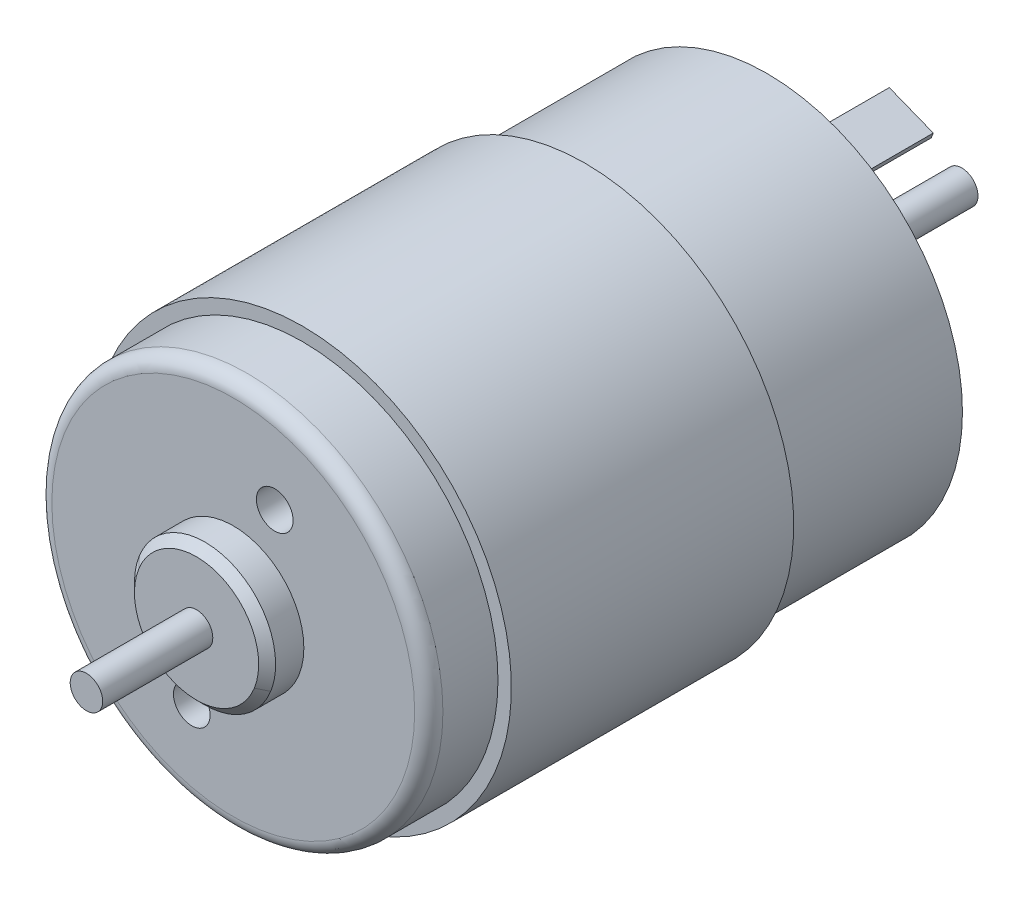
ISO-10303-21;
HEADER;
FILE_DESCRIPTION(('STEP AP214'),'2;1');
FILE_NAME('part.step','',(''),(''),'','','');
FILE_SCHEMA(('AUTOMOTIVE_DESIGN { 1 0 10303 214 1 1 1 1 }'));
ENDSEC;
DATA;
#1=APPLICATION_CONTEXT('core data for automotive mechanical design processes');
#2=APPLICATION_PROTOCOL_DEFINITION('international standard','automotive_design',2000,#1);
#3=PRODUCT_CONTEXT('',#1,'mechanical');
#4=PRODUCT('Part','Part','',(#3));
#5=PRODUCT_RELATED_PRODUCT_CATEGORY('part','',(#4));
#6=PRODUCT_DEFINITION_FORMATION('','',#4);
#7=PRODUCT_DEFINITION_CONTEXT('part definition',#1,'design');
#8=PRODUCT_DEFINITION('design','',#6,#7);
#9=PRODUCT_DEFINITION_SHAPE('','',#8);
#10=(LENGTH_UNIT() NAMED_UNIT(*) SI_UNIT(.MILLI.,.METRE.));
#11=(NAMED_UNIT(*) PLANE_ANGLE_UNIT() SI_UNIT($,.RADIAN.));
#12=(NAMED_UNIT(*) SI_UNIT($,.STERADIAN.) SOLID_ANGLE_UNIT());
#13=UNCERTAINTY_MEASURE_WITH_UNIT(LENGTH_MEASURE(1.E-05),#10,'distance_accuracy_value','');
#14=(GEOMETRIC_REPRESENTATION_CONTEXT(3) GLOBAL_UNCERTAINTY_ASSIGNED_CONTEXT((#13)) GLOBAL_UNIT_ASSIGNED_CONTEXT((#10,
#11,#12)) REPRESENTATION_CONTEXT('',''));
#15=CARTESIAN_POINT('',(0.,0.,0.));
#16=DIRECTION('',(0.,0.,1.));
#17=DIRECTION('',(1.,0.,0.));
#18=AXIS2_PLACEMENT_3D('',#15,#16,#17);
#19=CARTESIAN_POINT('',(0.,0.,48.2));
#20=DIRECTION('',(0.,0.,1.));
#21=DIRECTION('',(1.,0.,0.));
#22=AXIS2_PLACEMENT_3D('',#19,#20,#21);
#23=PLANE('',#22);
#24=CARTESIAN_POINT('',(0.,0.,48.2));
#25=DIRECTION('',(0.,0.,1.));
#26=DIRECTION('',(1.,0.,0.));
#27=AXIS2_PLACEMENT_3D('',#24,#25,#26);
#28=CIRCLE('',#27,1.15);
#29=CARTESIAN_POINT('',(1.15,0.,48.2));
#30=VERTEX_POINT('',#29);
#31=EDGE_CURVE('E195',#30,#30,#28,.F.);
#32=ORIENTED_EDGE('',*,*,#31,.F.);
#33=EDGE_LOOP('',(#32));
#34=FACE_BOUND('',#33,.T.);
#35=ADVANCED_FACE('F16',(#34),#23,.T.);
#36=CARTESIAN_POINT('',(0.,0.,-13.8));
#37=DIRECTION('',(0.,0.,1.));
#38=DIRECTION('',(1.,0.,0.));
#39=AXIS2_PLACEMENT_3D('',#36,#37,#38);
#40=CYLINDRICAL_SURFACE('',#39,1.15);
#41=ORIENTED_EDGE('',*,*,#31,.T.);
#42=EDGE_LOOP('',(#41));
#43=FACE_BOUND('',#42,.T.);
#44=CARTESIAN_POINT('',(0.,0.,40.4));
#45=DIRECTION('',(0.,0.,1.));
#46=DIRECTION('',(1.,0.,0.));
#47=AXIS2_PLACEMENT_3D('',#44,#45,#46);
#48=CIRCLE('',#47,1.15);
#49=CARTESIAN_POINT('',(1.15,0.,40.4));
#50=VERTEX_POINT('',#49);
#51=EDGE_CURVE('E191',#50,#50,#48,.F.);
#52=ORIENTED_EDGE('',*,*,#51,.F.);
#53=EDGE_LOOP('',(#52));
#54=FACE_BOUND('',#53,.T.);
#55=ADVANCED_FACE('F297',(#43,#54),#40,.T.);
#56=CARTESIAN_POINT('',(0.,0.,-13.8));
#57=DIRECTION('',(0.,0.,1.));
#58=DIRECTION('',(1.,0.,0.));
#59=AXIS2_PLACEMENT_3D('',#56,#57,#58);
#60=PLANE('',#59);
#61=CARTESIAN_POINT('',(0.,0.,-13.8));
#62=DIRECTION('',(0.,0.,1.));
#63=DIRECTION('',(1.,0.,0.));
#64=AXIS2_PLACEMENT_3D('',#61,#62,#63);
#65=CIRCLE('',#64,1.15);
#66=CARTESIAN_POINT('',(1.15,0.,-13.8));
#67=VERTEX_POINT('',#66);
#68=EDGE_CURVE('E110',#67,#67,#65,.T.);
#69=ORIENTED_EDGE('',*,*,#68,.F.);
#70=EDGE_LOOP('',(#69));
#71=FACE_BOUND('',#70,.T.);
#72=ADVANCED_FACE('F295',(#71),#60,.F.);
#73=CARTESIAN_POINT('',(0.,0.,40.4));
#74=DIRECTION('',(0.,0.,1.));
#75=DIRECTION('',(1.,0.,0.));
#76=AXIS2_PLACEMENT_3D('',#73,#74,#75);
#77=PLANE('',#76);
#78=CARTESIAN_POINT('',(0.,0.,40.4000000000337));
#79=DIRECTION('',(0.,0.,-1.));
#80=DIRECTION('',(-1.,0.,0.));
#81=AXIS2_PLACEMENT_3D('',#78,#79,#80);
#82=CIRCLE('',#81,4.39999999999257);
#83=CARTESIAN_POINT('',(4.09233299291247,-1.61641909016649,40.4000000000337));
#84=VERTEX_POINT('',#83);
#85=CARTESIAN_POINT('',(-4.09233299291145,1.61641909016907,40.4000000000337));
#86=VERTEX_POINT('',#85);
#87=EDGE_CURVE('E99',#84,#86,#82,.T.);
#88=ORIENTED_EDGE('',*,*,#87,.F.);
#89=CARTESIAN_POINT('',(0.,0.,40.4000000000337));
#90=DIRECTION('',(0.,0.,-1.));
#91=DIRECTION('',(-1.,0.,0.));
#92=AXIS2_PLACEMENT_3D('',#89,#90,#91);
#93=CIRCLE('',#92,4.39999999999257);
#94=EDGE_CURVE('E112',#86,#84,#93,.T.);
#95=ORIENTED_EDGE('',*,*,#94,.F.);
#96=EDGE_LOOP('',(#88,#95));
#97=FACE_BOUND('',#96,.T.);
#98=ORIENTED_EDGE('',*,*,#51,.T.);
#99=EDGE_LOOP('',(#98));
#100=FACE_BOUND('',#99,.T.);
#101=ADVANCED_FACE('F113',(#97,#100),#77,.T.);
#102=CARTESIAN_POINT('',(0.,0.,-13.8));
#103=DIRECTION('',(0.,0.,1.));
#104=DIRECTION('',(1.,0.,0.));
#105=AXIS2_PLACEMENT_3D('',#102,#103,#104);
#106=CYLINDRICAL_SURFACE('',#105,1.15);
#107=ORIENTED_EDGE('',*,*,#68,.T.);
#108=EDGE_LOOP('',(#107));
#109=FACE_BOUND('',#108,.T.);
#110=CARTESIAN_POINT('',(0.,0.,-2.6));
#111=DIRECTION('',(0.,0.,1.));
#112=DIRECTION('',(1.,0.,0.));
#113=AXIS2_PLACEMENT_3D('',#110,#111,#112);
#114=CIRCLE('',#113,1.15);
#115=CARTESIAN_POINT('',(1.15,0.,-2.6));
#116=VERTEX_POINT('',#115);
#117=EDGE_CURVE('E133',#116,#116,#114,.T.);
#118=ORIENTED_EDGE('',*,*,#117,.F.);
#119=EDGE_LOOP('',(#118));
#120=FACE_BOUND('',#119,.T.);
#121=ADVANCED_FACE('F288',(#109,#120),#106,.T.);
#122=CARTESIAN_POINT('',(-2.93894380030565,-7.44060544167246,34.5836800131004));
#123=DIRECTION('',(0.,0.,-1.));
#124=DIRECTION('',(0.,1.,0.));
#125=AXIS2_PLACEMENT_3D('',#122,#123,#124);
#126=PLANE('',#125);
#127=CARTESIAN_POINT('',(-2.93894380030565,-7.44060544167246,34.5836800131004));
#128=DIRECTION('',(0.,0.,-1.));
#129=DIRECTION('',(0.,1.,0.));
#130=AXIS2_PLACEMENT_3D('',#127,#128,#129);
#131=CIRCLE('',#130,1.3);
#132=CARTESIAN_POINT('',(-2.93894380030565,-6.14060544167246,34.5836800131004));
#133=VERTEX_POINT('',#132);
#134=EDGE_CURVE('E181',#133,#133,#131,.F.);
#135=ORIENTED_EDGE('',*,*,#134,.T.);
#136=EDGE_LOOP('',(#135));
#137=FACE_BOUND('',#136,.T.);
#138=ADVANCED_FACE('F284',(#137),#126,.F.);
#139=CARTESIAN_POINT('',(2.93894380030561,7.44060544167237,34.5836800131004));
#140=DIRECTION('',(0.,0.,-1.));
#141=DIRECTION('',(0.,1.,0.));
#142=AXIS2_PLACEMENT_3D('',#139,#140,#141);
#143=PLANE('',#142);
#144=CARTESIAN_POINT('',(2.9389438003056,7.44060544167237,34.5836800131004));
#145=DIRECTION('',(0.,0.,-1.));
#146=DIRECTION('',(0.,1.,0.));
#147=AXIS2_PLACEMENT_3D('',#144,#145,#146);
#148=CIRCLE('',#147,1.3);
#149=CARTESIAN_POINT('',(2.9389438003056,8.74060544167237,34.5836800131004));
#150=VERTEX_POINT('',#149);
#151=EDGE_CURVE('E176',#150,#150,#148,.F.);
#152=ORIENTED_EDGE('',*,*,#151,.T.);
#153=EDGE_LOOP('',(#152));
#154=FACE_BOUND('',#153,.T.);
#155=ADVANCED_FACE('F281',(#154),#143,.F.);
#156=CARTESIAN_POINT('',(0.,0.,39.8000000000138));
#157=DIRECTION('',(0.,0.,-1.));
#158=DIRECTION('',(-1.,0.,0.));
#159=AXIS2_PLACEMENT_3D('',#156,#157,#158);
#160=CONICAL_SURFACE('',#159,5.00000000000061,0.785398163387545);
#161=DIRECTION('',(-0.657662820492747,0.259768386339687,0.707106781186548));
#162=VECTOR('',#161,1.);
#163=CARTESIAN_POINT('',(464149.431814956,-183333.077628924,-499000.));
#164=LINE('',#163,#162);
#165=CARTESIAN_POINT('',(4.65037840102838,-1.83683987519109,39.8000000000177));
#166=VERTEX_POINT('',#165);
#167=EDGE_CURVE('E107',#84,#166,#164,.F.);
#168=ORIENTED_EDGE('',*,*,#167,.F.);
#169=ORIENTED_EDGE('',*,*,#87,.T.);
#170=DIRECTION('',(0.657662820492511,-0.259768386340284,0.707106781186548));
#171=VECTOR('',#170,1.);
#172=CARTESIAN_POINT('',(-464149.43181479,183333.077629345,-499000.));
#173=LINE('',#172,#171);
#174=CARTESIAN_POINT('',(-4.65037840102931,1.83683987518161,39.8000000000177));
#175=VERTEX_POINT('',#174);
#176=EDGE_CURVE('E104',#175,#86,#173,.T.);
#177=ORIENTED_EDGE('',*,*,#176,.F.);
#178=CARTESIAN_POINT('',(0.,0.,39.8));
#179=DIRECTION('',(0.,0.,1.));
#180=DIRECTION('',(1.,0.,0.));
#181=AXIS2_PLACEMENT_3D('',#178,#179,#180);
#182=CIRCLE('',#181,5.);
#183=EDGE_CURVE('E180',#166,#175,#182,.F.);
#184=ORIENTED_EDGE('',*,*,#183,.F.);
#185=EDGE_LOOP('',(#168,#169,#177,#184));
#186=FACE_BOUND('',#185,.T.);
#187=ADVANCED_FACE('F102',(#186),#160,.T.);
#188=CARTESIAN_POINT('',(0.,0.,39.8000000000707));
#189=DIRECTION('',(0.,0.,-1.));
#190=DIRECTION('',(-1.,0.,0.));
#191=AXIS2_PLACEMENT_3D('',#188,#189,#190);
#192=CONICAL_SURFACE('',#191,4.99999999992685,0.785398163373455);
#193=ORIENTED_EDGE('',*,*,#167,.T.);
#194=CARTESIAN_POINT('',(0.,0.,39.8));
#195=DIRECTION('',(0.,0.,1.));
#196=DIRECTION('',(1.,0.,0.));
#197=AXIS2_PLACEMENT_3D('',#194,#195,#196);
#198=CIRCLE('',#197,5.);
#199=EDGE_CURVE('E121',#175,#166,#198,.F.);
#200=ORIENTED_EDGE('',*,*,#199,.F.);
#201=ORIENTED_EDGE('',*,*,#176,.T.);
#202=ORIENTED_EDGE('',*,*,#94,.T.);
#203=EDGE_LOOP('',(#193,#200,#201,#202));
#204=FACE_BOUND('',#203,.T.);
#205=ADVANCED_FACE('F119',(#204),#192,.T.);
#206=CARTESIAN_POINT('',(0.,0.,-2.6));
#207=DIRECTION('',(0.,0.,-1.));
#208=DIRECTION('',(0.,1.,0.));
#209=AXIS2_PLACEMENT_3D('',#206,#207,#208);
#210=PLANE('',#209);
#211=CARTESIAN_POINT('',(0.,0.,-2.59999999997262));
#212=DIRECTION('',(0.,0.,1.));
#213=DIRECTION('',(0.,-1.,0.));
#214=AXIS2_PLACEMENT_3D('',#211,#212,#213);
#215=CIRCLE('',#214,4.39999999997964);
#216=CARTESIAN_POINT('',(0.,-4.39999999997964,-2.59999999997262));
#217=VERTEX_POINT('',#216);
#218=EDGE_CURVE('E171',#217,#217,#215,.T.);
#219=ORIENTED_EDGE('',*,*,#218,.F.);
#220=EDGE_LOOP('',(#219));
#221=FACE_BOUND('',#220,.T.);
#222=ORIENTED_EDGE('',*,*,#117,.T.);
#223=EDGE_LOOP('',(#222));
#224=FACE_BOUND('',#223,.T.);
#225=ADVANCED_FACE('F272',(#221,#224),#210,.T.);
#226=CARTESIAN_POINT('',(-2.93894380030563,-7.44060544167242,48.2));
#227=DIRECTION('',(0.,0.,-1.));
#228=DIRECTION('',(0.,1.,0.));
#229=AXIS2_PLACEMENT_3D('',#226,#227,#228);
#230=CYLINDRICAL_SURFACE('',#229,1.3);
#231=ORIENTED_EDGE('',*,*,#134,.F.);
#232=EDGE_LOOP('',(#231));
#233=FACE_BOUND('',#232,.T.);
#234=CARTESIAN_POINT('',(-2.93894380030564,-7.44060544167245,37.8));
#235=DIRECTION('',(0.,0.,-1.));
#236=DIRECTION('',(0.,1.,0.));
#237=AXIS2_PLACEMENT_3D('',#234,#235,#236);
#238=CIRCLE('',#237,1.3);
#239=CARTESIAN_POINT('',(-2.93894380030564,-6.14060544167245,37.8));
#240=VERTEX_POINT('',#239);
#241=EDGE_CURVE('E167',#240,#240,#238,.T.);
#242=ORIENTED_EDGE('',*,*,#241,.F.);
#243=EDGE_LOOP('',(#242));
#244=FACE_BOUND('',#243,.T.);
#245=ADVANCED_FACE('F268',(#233,#244),#230,.F.);
#246=CARTESIAN_POINT('',(2.93894380030562,7.44060544167241,48.2));
#247=DIRECTION('',(0.,0.,-1.));
#248=DIRECTION('',(0.,1.,0.));
#249=AXIS2_PLACEMENT_3D('',#246,#247,#248);
#250=CYLINDRICAL_SURFACE('',#249,1.3);
#251=ORIENTED_EDGE('',*,*,#151,.F.);
#252=EDGE_LOOP('',(#251));
#253=FACE_BOUND('',#252,.T.);
#254=CARTESIAN_POINT('',(2.93894380030561,7.44060544167238,37.8));
#255=DIRECTION('',(0.,0.,-1.));
#256=DIRECTION('',(0.,1.,0.));
#257=AXIS2_PLACEMENT_3D('',#254,#255,#256);
#258=CIRCLE('',#257,1.3);
#259=CARTESIAN_POINT('',(2.93894380030561,8.74060544167238,37.8));
#260=VERTEX_POINT('',#259);
#261=EDGE_CURVE('E163',#260,#260,#258,.T.);
#262=ORIENTED_EDGE('',*,*,#261,.F.);
#263=EDGE_LOOP('',(#262));
#264=FACE_BOUND('',#263,.T.);
#265=ADVANCED_FACE('F264',(#253,#264),#250,.F.);
#266=CARTESIAN_POINT('',(0.,0.,37.8));
#267=DIRECTION('',(0.,0.,1.));
#268=DIRECTION('',(1.,0.,0.));
#269=AXIS2_PLACEMENT_3D('',#266,#267,#268);
#270=CYLINDRICAL_SURFACE('',#269,5.);
#271=CARTESIAN_POINT('',(0.,0.,37.8));
#272=DIRECTION('',(0.,0.,1.));
#273=DIRECTION('',(1.,0.,0.));
#274=AXIS2_PLACEMENT_3D('',#271,#272,#273);
#275=CIRCLE('',#274,5.);
#276=CARTESIAN_POINT('',(5.,0.,37.8));
#277=VERTEX_POINT('',#276);
#278=EDGE_CURVE('E158',#277,#277,#275,.F.);
#279=ORIENTED_EDGE('',*,*,#278,.F.);
#280=EDGE_LOOP('',(#279));
#281=FACE_BOUND('',#280,.T.);
#282=ORIENTED_EDGE('',*,*,#199,.T.);
#283=ORIENTED_EDGE('',*,*,#183,.T.);
#284=EDGE_LOOP('',(#282,#283));
#285=FACE_BOUND('',#284,.T.);
#286=ADVANCED_FACE('F260',(#281,#285),#270,.T.);
#287=CARTESIAN_POINT('',(0.,0.,-1.99999999995271));
#288=DIRECTION('',(0.,0.,1.));
#289=DIRECTION('',(0.,-1.,0.));
#290=AXIS2_PLACEMENT_3D('',#287,#288,#289);
#291=CONICAL_SURFACE('',#290,4.99999999993729,0.785398163345564);
#292=CARTESIAN_POINT('',(0.,0.,-2.));
#293=DIRECTION('',(0.,0.,-1.));
#294=DIRECTION('',(0.,1.,0.));
#295=AXIS2_PLACEMENT_3D('',#292,#293,#294);
#296=CIRCLE('',#295,5.);
#297=CARTESIAN_POINT('',(0.,5.,-2.));
#298=VERTEX_POINT('',#297);
#299=EDGE_CURVE('E162',#298,#298,#296,.F.);
#300=ORIENTED_EDGE('',*,*,#299,.F.);
#301=EDGE_LOOP('',(#300));
#302=FACE_BOUND('',#301,.T.);
#303=ORIENTED_EDGE('',*,*,#218,.T.);
#304=EDGE_LOOP('',(#303));
#305=FACE_BOUND('',#304,.T.);
#306=ADVANCED_FACE('F256',(#302,#305),#291,.T.);
#307=CARTESIAN_POINT('',(4.1512581179317,10.5098551863623,-6.));
#308=DIRECTION('',(0.,0.,-1.));
#309=DIRECTION('',(0.,1.,0.));
#310=AXIS2_PLACEMENT_3D('',#307,#308,#309);
#311=PLANE('',#310);
#312=DIRECTION('',(0.367367975038203,0.930075680209052,0.));
#313=VECTOR('',#312,1.);
#314=CARTESIAN_POINT('',(5.70913488228186,9.89451382817328,-6.));
#315=LINE('',#314,#313);
#316=CARTESIAN_POINT('',(5.63566128727422,9.70849869213148,-6.));
#317=VERTEX_POINT('',#316);
#318=CARTESIAN_POINT('',(5.7826084772895,10.0805289642151,-6.));
#319=VERTEX_POINT('',#318);
#320=EDGE_CURVE('E175',#317,#319,#315,.T.);
#321=ORIENTED_EDGE('',*,*,#320,.F.);
#322=DIRECTION('',(0.930075680209052,-0.367367975038203,0.));
#323=VECTOR('',#322,1.);
#324=CARTESIAN_POINT('',(4.07778452292406,10.3238400503205,-6.));
#325=LINE('',#324,#323);
#326=CARTESIAN_POINT('',(2.51990775857389,10.9391814085095,-6.));
#327=VERTEX_POINT('',#326);
#328=EDGE_CURVE('E379',#327,#317,#325,.T.);
#329=ORIENTED_EDGE('',*,*,#328,.F.);
#330=DIRECTION('',(-0.367367975038203,-0.930075680209052,0.));
#331=VECTOR('',#330,1.);
#332=CARTESIAN_POINT('',(2.59338135358154,11.1251965445513,-6.));
#333=LINE('',#332,#331);
#334=CARTESIAN_POINT('',(2.66685494858918,11.3112116805931,-6.));
#335=VERTEX_POINT('',#334);
#336=EDGE_CURVE('E415',#335,#327,#333,.T.);
#337=ORIENTED_EDGE('',*,*,#336,.F.);
#338=DIRECTION('',(-0.930075680209052,0.367367975038203,0.));
#339=VECTOR('',#338,1.);
#340=CARTESIAN_POINT('',(4.22473171293934,10.6958703224041,-6.));
#341=LINE('',#340,#339);
#342=EDGE_CURVE('E391',#319,#335,#341,.T.);
#343=ORIENTED_EDGE('',*,*,#342,.F.);
#344=EDGE_LOOP('',(#321,#329,#337,#343));
#345=FACE_BOUND('',#344,.T.);
#346=ADVANCED_FACE('F252',(#345),#311,.T.);
#347=CARTESIAN_POINT('',(5.70913488228186,9.89451382817328,0.));
#348=DIRECTION('',(0.930075680209052,-0.367367975038203,0.));
#349=DIRECTION('',(0.367367975038203,0.930075680209052,0.));
#350=AXIS2_PLACEMENT_3D('',#347,#348,#349);
#351=PLANE('',#350);
#352=DIRECTION('',(0.367367975038203,0.930075680209052,0.));
#353=VECTOR('',#352,1.);
#354=CARTESIAN_POINT('',(5.70913488228186,9.89451382817328,0.));
#355=LINE('',#354,#353);
#356=CARTESIAN_POINT('',(5.7826084772895,10.0805289642151,0.));
#357=VERTEX_POINT('',#356);
#358=CARTESIAN_POINT('',(5.63566128727422,9.70849869213148,0.));
#359=VERTEX_POINT('',#358);
#360=EDGE_CURVE('E413',#357,#359,#355,.F.);
#361=ORIENTED_EDGE('',*,*,#360,.T.);
#362=DIRECTION('',(0.,0.,1.));
#363=VECTOR('',#362,1.);
#364=CARTESIAN_POINT('',(5.63566128727423,9.70849869213151,0.));
#365=LINE('',#364,#363);
#366=EDGE_CURVE('E375',#317,#359,#365,.T.);
#367=ORIENTED_EDGE('',*,*,#366,.F.);
#368=ORIENTED_EDGE('',*,*,#320,.T.);
#369=DIRECTION('',(0.,0.,1.));
#370=VECTOR('',#369,1.);
#371=CARTESIAN_POINT('',(5.7826084772895,10.0805289642151,0.));
#372=LINE('',#371,#370);
#373=EDGE_CURVE('E383',#357,#319,#372,.F.);
#374=ORIENTED_EDGE('',*,*,#373,.F.);
#375=EDGE_LOOP('',(#361,#367,#368,#374));
#376=FACE_BOUND('',#375,.T.);
#377=ADVANCED_FACE('F248',(#376),#351,.T.);
#378=CARTESIAN_POINT('',(2.59338135358154,11.1251965445513,0.));
#379=DIRECTION('',(-0.930075680209052,0.367367975038203,0.));
#380=DIRECTION('',(-0.367367975038203,-0.930075680209052,0.));
#381=AXIS2_PLACEMENT_3D('',#378,#379,#380);
#382=PLANE('',#381);
#383=DIRECTION('',(-0.367367975038203,-0.930075680209052,0.));
#384=VECTOR('',#383,1.);
#385=CARTESIAN_POINT('',(2.59338135358154,11.1251965445513,0.));
#386=LINE('',#385,#384);
#387=CARTESIAN_POINT('',(2.51990775857389,10.9391814085095,0.));
#388=VERTEX_POINT('',#387);
#389=CARTESIAN_POINT('',(2.66685494858918,11.3112116805931,0.));
#390=VERTEX_POINT('',#389);
#391=EDGE_CURVE('E418',#388,#390,#386,.F.);
#392=ORIENTED_EDGE('',*,*,#391,.T.);
#393=DIRECTION('',(0.,0.,1.));
#394=VECTOR('',#393,1.);
#395=CARTESIAN_POINT('',(2.66685494858918,11.3112116805931,0.));
#396=LINE('',#395,#394);
#397=EDGE_CURVE('E387',#335,#390,#396,.T.);
#398=ORIENTED_EDGE('',*,*,#397,.F.);
#399=ORIENTED_EDGE('',*,*,#336,.T.);
#400=DIRECTION('',(0.,0.,1.));
#401=VECTOR('',#400,1.);
#402=CARTESIAN_POINT('',(2.51990775857389,10.9391814085095,0.));
#403=LINE('',#402,#401);
#404=EDGE_CURVE('E371',#388,#327,#403,.F.);
#405=ORIENTED_EDGE('',*,*,#404,.F.);
#406=EDGE_LOOP('',(#392,#398,#399,#405));
#407=FACE_BOUND('',#406,.T.);
#408=ADVANCED_FACE('F244',(#407),#382,.T.);
#409=CARTESIAN_POINT('',(-4.1512581179317,-10.5098551863623,-6.));
#410=DIRECTION('',(0.,0.,-1.));
#411=DIRECTION('',(0.,1.,0.));
#412=AXIS2_PLACEMENT_3D('',#409,#410,#411);
#413=PLANE('',#412);
#414=DIRECTION('',(0.367367975038203,0.930075680209052,0.));
#415=VECTOR('',#414,1.);
#416=CARTESIAN_POINT('',(-2.59338135358154,-11.1251965445513,-6.));
#417=LINE('',#416,#415);
#418=CARTESIAN_POINT('',(-2.66685494858918,-11.3112116805931,-6.));
#419=VERTEX_POINT('',#418);
#420=CARTESIAN_POINT('',(-2.5199077585739,-10.9391814085095,-6.));
#421=VERTEX_POINT('',#420);
#422=EDGE_CURVE('E421',#419,#421,#417,.T.);
#423=ORIENTED_EDGE('',*,*,#422,.F.);
#424=DIRECTION('',(0.930075680209052,-0.367367975038203,0.));
#425=VECTOR('',#424,1.);
#426=CARTESIAN_POINT('',(-4.22473171293934,-10.6958703224041,-6.));
#427=LINE('',#426,#425);
#428=CARTESIAN_POINT('',(-5.7826084772895,-10.0805289642151,-6.));
#429=VERTEX_POINT('',#428);
#430=EDGE_CURVE('E355',#429,#419,#427,.T.);
#431=ORIENTED_EDGE('',*,*,#430,.F.);
#432=DIRECTION('',(-0.367367975038203,-0.930075680209052,0.));
#433=VECTOR('',#432,1.);
#434=CARTESIAN_POINT('',(-5.70913488228186,-9.8945138281733,-6.));
#435=LINE('',#434,#433);
#436=CARTESIAN_POINT('',(-5.63566128727422,-9.70849869213149,-6.));
#437=VERTEX_POINT('',#436);
#438=EDGE_CURVE('E428',#437,#429,#435,.T.);
#439=ORIENTED_EDGE('',*,*,#438,.F.);
#440=DIRECTION('',(-0.930075680209052,0.367367975038203,0.));
#441=VECTOR('',#440,1.);
#442=CARTESIAN_POINT('',(-4.07778452292406,-10.3238400503205,-6.));
#443=LINE('',#442,#441);
#444=EDGE_CURVE('E367',#421,#437,#443,.T.);
#445=ORIENTED_EDGE('',*,*,#444,.F.);
#446=EDGE_LOOP('',(#423,#431,#439,#445));
#447=FACE_BOUND('',#446,.T.);
#448=ADVANCED_FACE('F240',(#447),#413,.T.);
#449=CARTESIAN_POINT('',(-2.59338135358154,-11.1251965445513,0.));
#450=DIRECTION('',(0.930075680209052,-0.367367975038203,0.));
#451=DIRECTION('',(0.367367975038203,0.930075680209052,0.));
#452=AXIS2_PLACEMENT_3D('',#449,#450,#451);
#453=PLANE('',#452);
#454=DIRECTION('',(0.367367975038203,0.930075680209052,0.));
#455=VECTOR('',#454,1.);
#456=CARTESIAN_POINT('',(-2.59338135358154,-11.1251965445513,0.));
#457=LINE('',#456,#455);
#458=CARTESIAN_POINT('',(-2.5199077585739,-10.9391814085095,0.));
#459=VERTEX_POINT('',#458);
#460=CARTESIAN_POINT('',(-2.66685494858918,-11.3112116805931,0.));
#461=VERTEX_POINT('',#460);
#462=EDGE_CURVE('E425',#459,#461,#457,.F.);
#463=ORIENTED_EDGE('',*,*,#462,.T.);
#464=DIRECTION('',(0.,0.,1.));
#465=VECTOR('',#464,1.);
#466=CARTESIAN_POINT('',(-2.66685494858918,-11.3112116805931,0.));
#467=LINE('',#466,#465);
#468=EDGE_CURVE('E351',#419,#461,#467,.T.);
#469=ORIENTED_EDGE('',*,*,#468,.F.);
#470=ORIENTED_EDGE('',*,*,#422,.T.);
#471=DIRECTION('',(0.,0.,1.));
#472=VECTOR('',#471,1.);
#473=CARTESIAN_POINT('',(-2.5199077585739,-10.9391814085095,0.));
#474=LINE('',#473,#472);
#475=EDGE_CURVE('E359',#459,#421,#474,.F.);
#476=ORIENTED_EDGE('',*,*,#475,.F.);
#477=EDGE_LOOP('',(#463,#469,#470,#476));
#478=FACE_BOUND('',#477,.T.);
#479=ADVANCED_FACE('F236',(#478),#453,.T.);
#480=CARTESIAN_POINT('',(-5.70913488228186,-9.8945138281733,0.));
#481=DIRECTION('',(-0.930075680209052,0.367367975038203,0.));
#482=DIRECTION('',(-0.367367975038203,-0.930075680209052,0.));
#483=AXIS2_PLACEMENT_3D('',#480,#481,#482);
#484=PLANE('',#483);
#485=DIRECTION('',(-0.367367975038203,-0.930075680209052,0.));
#486=VECTOR('',#485,1.);
#487=CARTESIAN_POINT('',(-5.70913488228186,-9.8945138281733,0.));
#488=LINE('',#487,#486);
#489=CARTESIAN_POINT('',(-5.7826084772895,-10.0805289642151,0.));
#490=VERTEX_POINT('',#489);
#491=CARTESIAN_POINT('',(-5.63566128727422,-9.70849869213149,0.));
#492=VERTEX_POINT('',#491);
#493=EDGE_CURVE('E37',#490,#492,#488,.F.);
#494=ORIENTED_EDGE('',*,*,#493,.T.);
#495=DIRECTION('',(0.,0.,1.));
#496=VECTOR('',#495,1.);
#497=CARTESIAN_POINT('',(-5.63566128727423,-9.70849869213151,0.));
#498=LINE('',#497,#496);
#499=EDGE_CURVE('E363',#437,#492,#498,.T.);
#500=ORIENTED_EDGE('',*,*,#499,.F.);
#501=ORIENTED_EDGE('',*,*,#438,.T.);
#502=DIRECTION('',(0.,0.,1.));
#503=VECTOR('',#502,1.);
#504=CARTESIAN_POINT('',(-5.7826084772895,-10.0805289642151,0.));
#505=LINE('',#504,#503);
#506=EDGE_CURVE('E208',#490,#429,#505,.F.);
#507=ORIENTED_EDGE('',*,*,#506,.F.);
#508=EDGE_LOOP('',(#494,#500,#501,#507));
#509=FACE_BOUND('',#508,.T.);
#510=ADVANCED_FACE('F231',(#509),#484,.T.);
#511=CARTESIAN_POINT('',(0.,0.,37.8));
#512=DIRECTION('',(0.,0.,1.));
#513=DIRECTION('',(1.,0.,0.));
#514=AXIS2_PLACEMENT_3D('',#511,#512,#513);
#515=PLANE('',#514);
#516=CARTESIAN_POINT('',(0.,0.,37.8));
#517=DIRECTION('',(0.,0.,-1.));
#518=DIRECTION('',(0.930075680209052,-0.367367975038203,0.));
#519=AXIS2_PLACEMENT_3D('',#516,#517,#518);
#520=CIRCLE('',#519,12.85);
#521=CARTESIAN_POINT('',(11.9514724906863,-4.72067847924091,37.8));
#522=VERTEX_POINT('',#521);
#523=CARTESIAN_POINT('',(-11.9514724906863,4.72067847924091,37.8));
#524=VERTEX_POINT('',#523);
#525=EDGE_CURVE('E200',#522,#524,#520,.T.);
#526=ORIENTED_EDGE('',*,*,#525,.F.);
#527=CARTESIAN_POINT('',(0.,0.,37.8));
#528=DIRECTION('',(0.,0.,-1.));
#529=DIRECTION('',(-0.930075680209052,0.367367975038203,0.));
#530=AXIS2_PLACEMENT_3D('',#527,#528,#529);
#531=CIRCLE('',#530,12.85);
#532=EDGE_CURVE('E157',#524,#522,#531,.T.);
#533=ORIENTED_EDGE('',*,*,#532,.F.);
#534=EDGE_LOOP('',(#526,#533));
#535=FACE_BOUND('',#534,.T.);
#536=ORIENTED_EDGE('',*,*,#278,.T.);
#537=EDGE_LOOP('',(#536));
#538=FACE_BOUND('',#537,.T.);
#539=ORIENTED_EDGE('',*,*,#261,.T.);
#540=EDGE_LOOP('',(#539));
#541=FACE_BOUND('',#540,.T.);
#542=ORIENTED_EDGE('',*,*,#241,.T.);
#543=EDGE_LOOP('',(#542));
#544=FACE_BOUND('',#543,.T.);
#545=ADVANCED_FACE('F210',(#535,#538,#541,#544),#515,.T.);
#546=CARTESIAN_POINT('',(0.,0.,0.));
#547=DIRECTION('',(0.,0.,-1.));
#548=DIRECTION('',(0.,1.,0.));
#549=AXIS2_PLACEMENT_3D('',#546,#547,#548);
#550=CYLINDRICAL_SURFACE('',#549,5.);
#551=ORIENTED_EDGE('',*,*,#299,.T.);
#552=EDGE_LOOP('',(#551));
#553=FACE_BOUND('',#552,.T.);
#554=CARTESIAN_POINT('',(0.,0.,0.));
#555=DIRECTION('',(0.,0.,-1.));
#556=DIRECTION('',(0.,1.,0.));
#557=AXIS2_PLACEMENT_3D('',#554,#555,#556);
#558=CIRCLE('',#557,5.);
#559=CARTESIAN_POINT('',(0.,5.,0.));
#560=VERTEX_POINT('',#559);
#561=EDGE_CURVE('E152',#560,#560,#558,.T.);
#562=ORIENTED_EDGE('',*,*,#561,.T.);
#563=EDGE_LOOP('',(#562));
#564=FACE_BOUND('',#563,.T.);
#565=ADVANCED_FACE('F230',(#553,#564),#550,.T.);
#566=CARTESIAN_POINT('',(4.22473171293934,10.6958703224041,0.));
#567=DIRECTION('',(0.367367975038203,0.930075680209052,0.));
#568=DIRECTION('',(-0.930075680209052,0.367367975038203,0.));
#569=AXIS2_PLACEMENT_3D('',#566,#567,#568);
#570=PLANE('',#569);
#571=DIRECTION('',(0.930075680209049,-0.367367975038209,0.));
#572=VECTOR('',#571,1.);
#573=CARTESIAN_POINT('',(2.66685494858918,11.3112116805931,0.));
#574=LINE('',#573,#572);
#575=EDGE_CURVE('E156',#390,#357,#574,.T.);
#576=ORIENTED_EDGE('',*,*,#575,.T.);
#577=ORIENTED_EDGE('',*,*,#373,.T.);
#578=ORIENTED_EDGE('',*,*,#342,.T.);
#579=ORIENTED_EDGE('',*,*,#397,.T.);
#580=EDGE_LOOP('',(#576,#577,#578,#579));
#581=FACE_BOUND('',#580,.T.);
#582=ADVANCED_FACE('F461',(#581),#570,.T.);
#583=CARTESIAN_POINT('',(4.07778452292406,10.3238400503205,0.));
#584=DIRECTION('',(-0.367367975038203,-0.930075680209052,0.));
#585=DIRECTION('',(0.930075680209052,-0.367367975038203,0.));
#586=AXIS2_PLACEMENT_3D('',#583,#584,#585);
#587=PLANE('',#586);
#588=DIRECTION('',(-0.930075680209047,0.367367975038215,0.));
#589=VECTOR('',#588,1.);
#590=CARTESIAN_POINT('',(5.63566128727422,9.70849869213147,0.));
#591=LINE('',#590,#589);
#592=EDGE_CURVE('E450',#359,#388,#591,.T.);
#593=ORIENTED_EDGE('',*,*,#592,.T.);
#594=ORIENTED_EDGE('',*,*,#404,.T.);
#595=ORIENTED_EDGE('',*,*,#328,.T.);
#596=ORIENTED_EDGE('',*,*,#366,.T.);
#597=EDGE_LOOP('',(#593,#594,#595,#596));
#598=FACE_BOUND('',#597,.T.);
#599=ADVANCED_FACE('F467',(#598),#587,.T.);
#600=CARTESIAN_POINT('',(-4.07778452292406,-10.3238400503205,0.));
#601=DIRECTION('',(0.367367975038203,0.930075680209052,0.));
#602=DIRECTION('',(-0.930075680209052,0.367367975038203,0.));
#603=AXIS2_PLACEMENT_3D('',#600,#601,#602);
#604=PLANE('',#603);
#605=DIRECTION('',(0.930075680209049,-0.367367975038211,0.));
#606=VECTOR('',#605,1.);
#607=CARTESIAN_POINT('',(-5.63566128727422,-9.70849869213149,0.));
#608=LINE('',#607,#606);
#609=EDGE_CURVE('E446',#492,#459,#608,.T.);
#610=ORIENTED_EDGE('',*,*,#609,.T.);
#611=ORIENTED_EDGE('',*,*,#475,.T.);
#612=ORIENTED_EDGE('',*,*,#444,.T.);
#613=ORIENTED_EDGE('',*,*,#499,.T.);
#614=EDGE_LOOP('',(#610,#611,#612,#613));
#615=FACE_BOUND('',#614,.T.);
#616=ADVANCED_FACE('F445',(#615),#604,.T.);
#617=CARTESIAN_POINT('',(-4.22473171293934,-10.6958703224041,0.));
#618=DIRECTION('',(-0.367367975038203,-0.930075680209052,0.));
#619=DIRECTION('',(0.930075680209052,-0.367367975038203,0.));
#620=AXIS2_PLACEMENT_3D('',#617,#618,#619);
#621=PLANE('',#620);
#622=DIRECTION('',(-0.930075680209049,0.367367975038209,0.));
#623=VECTOR('',#622,1.);
#624=CARTESIAN_POINT('',(-2.66685494858918,-11.3112116805931,0.));
#625=LINE('',#624,#623);
#626=EDGE_CURVE('E347',#461,#490,#625,.T.);
#627=ORIENTED_EDGE('',*,*,#626,.T.);
#628=ORIENTED_EDGE('',*,*,#506,.T.);
#629=ORIENTED_EDGE('',*,*,#430,.T.);
#630=ORIENTED_EDGE('',*,*,#468,.T.);
#631=EDGE_LOOP('',(#627,#628,#629,#630));
#632=FACE_BOUND('',#631,.T.);
#633=ADVANCED_FACE('F337',(#632),#621,.T.);
#634=CARTESIAN_POINT('',(0.,0.,36.8));
#635=DIRECTION('',(0.,0.,-1.));
#636=DIRECTION('',(-0.930075680209052,0.367367975038203,0.));
#637=AXIS2_PLACEMENT_3D('',#634,#635,#636);
#638=TOROIDAL_SURFACE('',#637,12.85,1.);
#639=ORIENTED_EDGE('',*,*,#525,.T.);
#640=ORIENTED_EDGE('',*,*,#532,.T.);
#641=EDGE_LOOP('',(#639,#640));
#642=FACE_BOUND('',#641,.T.);
#643=CARTESIAN_POINT('',(0.,0.,36.8));
#644=DIRECTION('',(0.,0.,1.));
#645=DIRECTION('',(1.,0.,0.));
#646=AXIS2_PLACEMENT_3D('',#643,#644,#645);
#647=CIRCLE('',#646,13.85);
#648=CARTESIAN_POINT('',(13.85,0.,36.8));
#649=VERTEX_POINT('',#648);
#650=EDGE_CURVE('E151',#649,#649,#647,.F.);
#651=ORIENTED_EDGE('',*,*,#650,.F.);
#652=EDGE_LOOP('',(#651));
#653=FACE_BOUND('',#652,.T.);
#654=ADVANCED_FACE('F202',(#642,#653),#638,.T.);
#655=CARTESIAN_POINT('',(0.,0.,0.));
#656=DIRECTION('',(0.,0.,1.));
#657=DIRECTION('',(1.,0.,0.));
#658=AXIS2_PLACEMENT_3D('',#655,#656,#657);
#659=PLANE('',#658);
#660=ORIENTED_EDGE('',*,*,#626,.F.);
#661=ORIENTED_EDGE('',*,*,#462,.F.);
#662=ORIENTED_EDGE('',*,*,#609,.F.);
#663=ORIENTED_EDGE('',*,*,#493,.F.);
#664=EDGE_LOOP('',(#660,#661,#662,#663));
#665=FACE_BOUND('',#664,.T.);
#666=ORIENTED_EDGE('',*,*,#592,.F.);
#667=ORIENTED_EDGE('',*,*,#360,.F.);
#668=ORIENTED_EDGE('',*,*,#575,.F.);
#669=ORIENTED_EDGE('',*,*,#391,.F.);
#670=EDGE_LOOP('',(#666,#667,#668,#669));
#671=FACE_BOUND('',#670,.T.);
#672=CARTESIAN_POINT('',(0.,0.,0.));
#673=DIRECTION('',(0.,0.,1.));
#674=DIRECTION('',(1.,0.,0.));
#675=AXIS2_PLACEMENT_3D('',#672,#673,#674);
#676=CIRCLE('',#675,13.85);
#677=CARTESIAN_POINT('',(13.85,0.,0.));
#678=VERTEX_POINT('',#677);
#679=EDGE_CURVE('E147',#678,#678,#676,.T.);
#680=ORIENTED_EDGE('',*,*,#679,.F.);
#681=EDGE_LOOP('',(#680));
#682=FACE_BOUND('',#681,.T.);
#683=ORIENTED_EDGE('',*,*,#561,.F.);
#684=EDGE_LOOP('',(#683));
#685=FACE_BOUND('',#684,.T.);
#686=ADVANCED_FACE('F330',(#665,#671,#682,#685),#659,.F.);
#687=CARTESIAN_POINT('',(0.,0.,0.));
#688=DIRECTION('',(0.,0.,1.));
#689=DIRECTION('',(1.,0.,0.));
#690=AXIS2_PLACEMENT_3D('',#687,#688,#689);
#691=CYLINDRICAL_SURFACE('',#690,13.85);
#692=CARTESIAN_POINT('',(0.,0.,32.9));
#693=DIRECTION('',(0.,0.,1.));
#694=DIRECTION('',(1.,0.,0.));
#695=AXIS2_PLACEMENT_3D('',#692,#693,#694);
#696=CIRCLE('',#695,13.85);
#697=CARTESIAN_POINT('',(13.85,0.,32.9));
#698=VERTEX_POINT('',#697);
#699=EDGE_CURVE('E143',#698,#698,#696,.T.);
#700=ORIENTED_EDGE('',*,*,#699,.T.);
#701=EDGE_LOOP('',(#700));
#702=FACE_BOUND('',#701,.T.);
#703=ORIENTED_EDGE('',*,*,#650,.T.);
#704=EDGE_LOOP('',(#703));
#705=FACE_BOUND('',#704,.T.);
#706=ADVANCED_FACE('F326',(#702,#705),#691,.T.);
#707=CARTESIAN_POINT('',(0.,0.,0.));
#708=DIRECTION('',(0.,0.,1.));
#709=DIRECTION('',(1.,0.,0.));
#710=AXIS2_PLACEMENT_3D('',#707,#708,#709);
#711=CYLINDRICAL_SURFACE('',#710,13.85);
#712=ORIENTED_EDGE('',*,*,#679,.T.);
#713=EDGE_LOOP('',(#712));
#714=FACE_BOUND('',#713,.T.);
#715=CARTESIAN_POINT('',(0.,0.,12.9));
#716=DIRECTION('',(0.,0.,1.));
#717=DIRECTION('',(1.,0.,0.));
#718=AXIS2_PLACEMENT_3D('',#715,#716,#717);
#719=CIRCLE('',#718,13.85);
#720=CARTESIAN_POINT('',(13.85,0.,12.9));
#721=VERTEX_POINT('',#720);
#722=EDGE_CURVE('E139',#721,#721,#719,.T.);
#723=ORIENTED_EDGE('',*,*,#722,.F.);
#724=EDGE_LOOP('',(#723));
#725=FACE_BOUND('',#724,.T.);
#726=ADVANCED_FACE('F322',(#714,#725),#711,.T.);
#727=CARTESIAN_POINT('',(0.,0.,32.9));
#728=DIRECTION('',(0.,0.,-1.));
#729=DIRECTION('',(0.,1.,0.));
#730=AXIS2_PLACEMENT_3D('',#727,#728,#729);
#731=PLANE('',#730);
#732=CARTESIAN_POINT('',(0.,0.,32.9));
#733=DIRECTION('',(0.,0.,-1.));
#734=DIRECTION('',(0.,1.,0.));
#735=AXIS2_PLACEMENT_3D('',#732,#733,#734);
#736=CIRCLE('',#735,14.8);
#737=CARTESIAN_POINT('',(0.,14.8,32.9));
#738=VERTEX_POINT('',#737);
#739=EDGE_CURVE('E28',#738,#738,#736,.T.);
#740=ORIENTED_EDGE('',*,*,#739,.F.);
#741=EDGE_LOOP('',(#740));
#742=FACE_BOUND('',#741,.T.);
#743=ORIENTED_EDGE('',*,*,#699,.F.);
#744=EDGE_LOOP('',(#743));
#745=FACE_BOUND('',#744,.T.);
#746=ADVANCED_FACE('F315',(#742,#745),#731,.F.);
#747=CARTESIAN_POINT('',(0.,0.,12.9));
#748=DIRECTION('',(0.,0.,-1.));
#749=DIRECTION('',(0.,1.,0.));
#750=AXIS2_PLACEMENT_3D('',#747,#748,#749);
#751=PLANE('',#750);
#752=CARTESIAN_POINT('',(0.,0.,12.9));
#753=DIRECTION('',(0.,0.,-1.));
#754=DIRECTION('',(0.,1.,0.));
#755=AXIS2_PLACEMENT_3D('',#752,#753,#754);
#756=CIRCLE('',#755,14.8);
#757=CARTESIAN_POINT('',(0.,14.8,12.9));
#758=VERTEX_POINT('',#757);
#759=EDGE_CURVE('E11',#758,#758,#756,.F.);
#760=ORIENTED_EDGE('',*,*,#759,.F.);
#761=EDGE_LOOP('',(#760));
#762=FACE_BOUND('',#761,.T.);
#763=ORIENTED_EDGE('',*,*,#722,.T.);
#764=EDGE_LOOP('',(#763));
#765=FACE_BOUND('',#764,.T.);
#766=ADVANCED_FACE('F309',(#762,#765),#751,.T.);
#767=CARTESIAN_POINT('',(0.,0.,32.9));
#768=DIRECTION('',(0.,0.,-1.));
#769=DIRECTION('',(0.,1.,0.));
#770=AXIS2_PLACEMENT_3D('',#767,#768,#769);
#771=CYLINDRICAL_SURFACE('',#770,14.8);
#772=ORIENTED_EDGE('',*,*,#739,.T.);
#773=EDGE_LOOP('',(#772));
#774=FACE_BOUND('',#773,.T.);
#775=ORIENTED_EDGE('',*,*,#759,.T.);
#776=EDGE_LOOP('',(#775));
#777=FACE_BOUND('',#776,.T.);
#778=ADVANCED_FACE('F307',(#774,#777),#771,.T.);
#779=CLOSED_SHELL('',(#35,#55,#72,#101,#121,#138,#155,#187,#205,#225,#245,#265,#286,#306,#346,
#377,#408,#448,#479,#510,#545,#565,#582,#599,#616,#633,#654,#686,#706,#726,#746,#766,#778));
#780=MANIFOLD_SOLID_BREP('B1',#779);
#781=ADVANCED_BREP_SHAPE_REPRESENTATION('',(#18,#780),#14);
#782=SHAPE_DEFINITION_REPRESENTATION(#9,#781);
ENDSEC;
END-ISO-10303-21;
